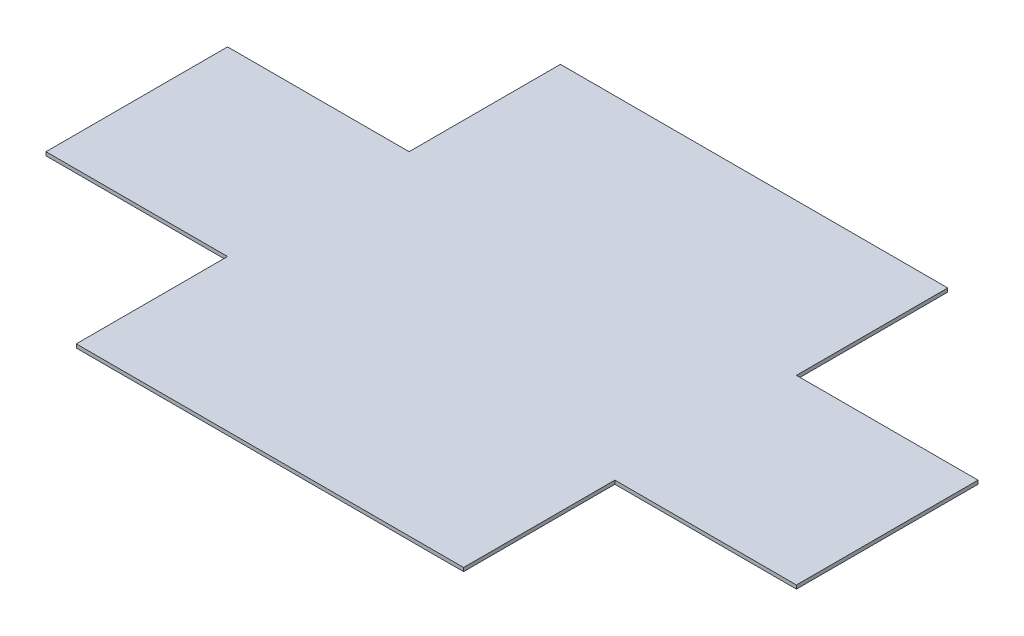
ISO-10303-21;
HEADER;
FILE_DESCRIPTION(('STEP AP214'),'2;1');
FILE_NAME('part.step','',(''),(''),'','','');
FILE_SCHEMA(('AUTOMOTIVE_DESIGN { 1 0 10303 214 1 1 1 1 }'));
ENDSEC;
DATA;
#1=APPLICATION_CONTEXT('core data for automotive mechanical design processes');
#2=APPLICATION_PROTOCOL_DEFINITION('international standard','automotive_design',2000,#1);
#3=PRODUCT_CONTEXT('',#1,'mechanical');
#4=PRODUCT('Part','Part','',(#3));
#5=PRODUCT_RELATED_PRODUCT_CATEGORY('part','',(#4));
#6=PRODUCT_DEFINITION_FORMATION('','',#4);
#7=PRODUCT_DEFINITION_CONTEXT('part definition',#1,'design');
#8=PRODUCT_DEFINITION('design','',#6,#7);
#9=PRODUCT_DEFINITION_SHAPE('','',#8);
#10=(LENGTH_UNIT() NAMED_UNIT(*) SI_UNIT(.MILLI.,.METRE.));
#11=(NAMED_UNIT(*) PLANE_ANGLE_UNIT() SI_UNIT($,.RADIAN.));
#12=(NAMED_UNIT(*) SI_UNIT($,.STERADIAN.) SOLID_ANGLE_UNIT());
#13=UNCERTAINTY_MEASURE_WITH_UNIT(LENGTH_MEASURE(1.E-05),#10,'distance_accuracy_value','');
#14=(GEOMETRIC_REPRESENTATION_CONTEXT(3) GLOBAL_UNCERTAINTY_ASSIGNED_CONTEXT((#13)) GLOBAL_UNIT_ASSIGNED_CONTEXT((#10,
#11,#12)) REPRESENTATION_CONTEXT('',''));
#15=CARTESIAN_POINT('',(0.,0.,0.));
#16=DIRECTION('',(0.,0.,1.));
#17=DIRECTION('',(1.,0.,0.));
#18=AXIS2_PLACEMENT_3D('',#15,#16,#17);
#19=CARTESIAN_POINT('',(160.,3.,-75.));
#20=DIRECTION('',(0.,0.,1.));
#21=DIRECTION('',(1.,0.,0.));
#22=AXIS2_PLACEMENT_3D('',#19,#20,#21);
#23=PLANE('',#22);
#24=DIRECTION('',(-1.,0.,0.));
#25=VECTOR('',#24,1.);
#26=CARTESIAN_POINT('',(160.,0.,-75.));
#27=LINE('',#26,#25);
#28=CARTESIAN_POINT('',(310.,0.,-75.));
#29=VERTEX_POINT('',#28);
#30=CARTESIAN_POINT('',(160.,0.,-75.));
#31=VERTEX_POINT('',#30);
#32=EDGE_CURVE('E155',#29,#31,#27,.T.);
#33=ORIENTED_EDGE('',*,*,#32,.T.);
#34=DIRECTION('',(0.,-1.,0.));
#35=VECTOR('',#34,1.);
#36=CARTESIAN_POINT('',(160.,3.,-75.));
#37=LINE('',#36,#35);
#38=CARTESIAN_POINT('',(160.,3.,-75.));
#39=VERTEX_POINT('',#38);
#40=EDGE_CURVE('E11',#39,#31,#37,.T.);
#41=ORIENTED_EDGE('',*,*,#40,.F.);
#42=DIRECTION('',(-1.,0.,0.));
#43=VECTOR('',#42,1.);
#44=CARTESIAN_POINT('',(160.,3.,-75.));
#45=LINE('',#44,#43);
#46=CARTESIAN_POINT('',(310.,3.,-75.));
#47=VERTEX_POINT('',#46);
#48=EDGE_CURVE('E177',#47,#39,#45,.T.);
#49=ORIENTED_EDGE('',*,*,#48,.F.);
#50=DIRECTION('',(0.,-1.,0.));
#51=VECTOR('',#50,1.);
#52=CARTESIAN_POINT('',(310.,3.,-75.));
#53=LINE('',#52,#51);
#54=EDGE_CURVE('E151',#47,#29,#53,.T.);
#55=ORIENTED_EDGE('',*,*,#54,.T.);
#56=EDGE_LOOP('',(#33,#41,#49,#55));
#57=FACE_BOUND('',#56,.T.);
#58=ADVANCED_FACE('F35',(#57),#23,.F.);
#59=CARTESIAN_POINT('',(160.,3.,-75.));
#60=DIRECTION('',(-1.,0.,0.));
#61=DIRECTION('',(0.,0.,1.));
#62=AXIS2_PLACEMENT_3D('',#59,#60,#61);
#63=PLANE('',#62);
#64=DIRECTION('',(0.,0.,-1.));
#65=VECTOR('',#64,1.);
#66=CARTESIAN_POINT('',(160.,0.,-75.));
#67=LINE('',#66,#65);
#68=CARTESIAN_POINT('',(160.,0.,-200.));
#69=VERTEX_POINT('',#68);
#70=EDGE_CURVE('E158',#31,#69,#67,.T.);
#71=ORIENTED_EDGE('',*,*,#70,.T.);
#72=DIRECTION('',(0.,-1.,0.));
#73=VECTOR('',#72,1.);
#74=CARTESIAN_POINT('',(160.,3.,-200.));
#75=LINE('',#74,#73);
#76=CARTESIAN_POINT('',(160.,3.,-200.));
#77=VERTEX_POINT('',#76);
#78=EDGE_CURVE('E43',#77,#69,#75,.T.);
#79=ORIENTED_EDGE('',*,*,#78,.F.);
#80=DIRECTION('',(0.,0.,-1.));
#81=VECTOR('',#80,1.);
#82=CARTESIAN_POINT('',(160.,3.,-75.));
#83=LINE('',#82,#81);
#84=EDGE_CURVE('E106',#39,#77,#83,.T.);
#85=ORIENTED_EDGE('',*,*,#84,.F.);
#86=ORIENTED_EDGE('',*,*,#40,.T.);
#87=EDGE_LOOP('',(#71,#79,#85,#86));
#88=FACE_BOUND('',#87,.T.);
#89=ADVANCED_FACE('F255',(#88),#63,.F.);
#90=CARTESIAN_POINT('',(-160.,3.,-200.));
#91=DIRECTION('',(0.,0.,1.));
#92=DIRECTION('',(1.,0.,0.));
#93=AXIS2_PLACEMENT_3D('',#90,#91,#92);
#94=PLANE('',#93);
#95=DIRECTION('',(-1.,0.,0.));
#96=VECTOR('',#95,1.);
#97=CARTESIAN_POINT('',(-160.,0.,-200.));
#98=LINE('',#97,#96);
#99=CARTESIAN_POINT('',(-160.,0.,-200.));
#100=VERTEX_POINT('',#99);
#101=EDGE_CURVE('E160',#69,#100,#98,.T.);
#102=ORIENTED_EDGE('',*,*,#101,.T.);
#103=DIRECTION('',(0.,-1.,0.));
#104=VECTOR('',#103,1.);
#105=CARTESIAN_POINT('',(-160.,3.,-200.));
#106=LINE('',#105,#104);
#107=CARTESIAN_POINT('',(-160.,3.,-200.));
#108=VERTEX_POINT('',#107);
#109=EDGE_CURVE('E196',#108,#100,#106,.T.);
#110=ORIENTED_EDGE('',*,*,#109,.F.);
#111=DIRECTION('',(-1.,0.,0.));
#112=VECTOR('',#111,1.);
#113=CARTESIAN_POINT('',(-160.,3.,-200.));
#114=LINE('',#113,#112);
#115=EDGE_CURVE('E204',#77,#108,#114,.T.);
#116=ORIENTED_EDGE('',*,*,#115,.F.);
#117=ORIENTED_EDGE('',*,*,#78,.T.);
#118=EDGE_LOOP('',(#102,#110,#116,#117));
#119=FACE_BOUND('',#118,.T.);
#120=ADVANCED_FACE('F202',(#119),#94,.F.);
#121=CARTESIAN_POINT('',(-160.,3.,-75.));
#122=DIRECTION('',(1.,0.,0.));
#123=DIRECTION('',(0.,0.,-1.));
#124=AXIS2_PLACEMENT_3D('',#121,#122,#123);
#125=PLANE('',#124);
#126=DIRECTION('',(0.,0.,1.));
#127=VECTOR('',#126,1.);
#128=CARTESIAN_POINT('',(-160.,0.,-75.));
#129=LINE('',#128,#127);
#130=CARTESIAN_POINT('',(-160.,0.,-75.));
#131=VERTEX_POINT('',#130);
#132=EDGE_CURVE('E162',#100,#131,#129,.T.);
#133=ORIENTED_EDGE('',*,*,#132,.T.);
#134=DIRECTION('',(0.,-1.,0.));
#135=VECTOR('',#134,1.);
#136=CARTESIAN_POINT('',(-160.,3.,-75.));
#137=LINE('',#136,#135);
#138=CARTESIAN_POINT('',(-160.,3.,-75.));
#139=VERTEX_POINT('',#138);
#140=EDGE_CURVE('E193',#139,#131,#137,.T.);
#141=ORIENTED_EDGE('',*,*,#140,.F.);
#142=DIRECTION('',(0.,0.,1.));
#143=VECTOR('',#142,1.);
#144=CARTESIAN_POINT('',(-160.,3.,-75.));
#145=LINE('',#144,#143);
#146=EDGE_CURVE('E222',#108,#139,#145,.T.);
#147=ORIENTED_EDGE('',*,*,#146,.F.);
#148=ORIENTED_EDGE('',*,*,#109,.T.);
#149=EDGE_LOOP('',(#133,#141,#147,#148));
#150=FACE_BOUND('',#149,.T.);
#151=ADVANCED_FACE('F213',(#150),#125,.F.);
#152=CARTESIAN_POINT('',(-310.,3.,-75.));
#153=DIRECTION('',(0.,0.,1.));
#154=DIRECTION('',(1.,0.,0.));
#155=AXIS2_PLACEMENT_3D('',#152,#153,#154);
#156=PLANE('',#155);
#157=DIRECTION('',(-1.,0.,0.));
#158=VECTOR('',#157,1.);
#159=CARTESIAN_POINT('',(-310.,0.,-75.));
#160=LINE('',#159,#158);
#161=CARTESIAN_POINT('',(-310.,0.,-75.));
#162=VERTEX_POINT('',#161);
#163=EDGE_CURVE('E164',#131,#162,#160,.T.);
#164=ORIENTED_EDGE('',*,*,#163,.T.);
#165=DIRECTION('',(0.,-1.,0.));
#166=VECTOR('',#165,1.);
#167=CARTESIAN_POINT('',(-310.,3.,-75.));
#168=LINE('',#167,#166);
#169=CARTESIAN_POINT('',(-310.,3.,-75.));
#170=VERTEX_POINT('',#169);
#171=EDGE_CURVE('E190',#170,#162,#168,.T.);
#172=ORIENTED_EDGE('',*,*,#171,.F.);
#173=DIRECTION('',(-1.,0.,0.));
#174=VECTOR('',#173,1.);
#175=CARTESIAN_POINT('',(-310.,3.,-75.));
#176=LINE('',#175,#174);
#177=EDGE_CURVE('E219',#139,#170,#176,.T.);
#178=ORIENTED_EDGE('',*,*,#177,.F.);
#179=ORIENTED_EDGE('',*,*,#140,.T.);
#180=EDGE_LOOP('',(#164,#172,#178,#179));
#181=FACE_BOUND('',#180,.T.);
#182=ADVANCED_FACE('F217',(#181),#156,.F.);
#183=CARTESIAN_POINT('',(-310.,3.,75.0000000000001));
#184=DIRECTION('',(1.,0.,0.));
#185=DIRECTION('',(0.,0.,-1.));
#186=AXIS2_PLACEMENT_3D('',#183,#184,#185);
#187=PLANE('',#186);
#188=DIRECTION('',(0.,0.,1.));
#189=VECTOR('',#188,1.);
#190=CARTESIAN_POINT('',(-310.,0.,75.0000000000001));
#191=LINE('',#190,#189);
#192=CARTESIAN_POINT('',(-310.,0.,75.0000000000001));
#193=VERTEX_POINT('',#192);
#194=EDGE_CURVE('E166',#162,#193,#191,.T.);
#195=ORIENTED_EDGE('',*,*,#194,.T.);
#196=DIRECTION('',(0.,-1.,0.));
#197=VECTOR('',#196,1.);
#198=CARTESIAN_POINT('',(-310.,3.,75.0000000000001));
#199=LINE('',#198,#197);
#200=CARTESIAN_POINT('',(-310.,3.,75.0000000000001));
#201=VERTEX_POINT('',#200);
#202=EDGE_CURVE('E187',#201,#193,#199,.T.);
#203=ORIENTED_EDGE('',*,*,#202,.F.);
#204=DIRECTION('',(0.,0.,1.));
#205=VECTOR('',#204,1.);
#206=CARTESIAN_POINT('',(-310.,3.,75.0000000000001));
#207=LINE('',#206,#205);
#208=EDGE_CURVE('E221',#170,#201,#207,.T.);
#209=ORIENTED_EDGE('',*,*,#208,.F.);
#210=ORIENTED_EDGE('',*,*,#171,.T.);
#211=EDGE_LOOP('',(#195,#203,#209,#210));
#212=FACE_BOUND('',#211,.T.);
#213=ADVANCED_FACE('F268',(#212),#187,.F.);
#214=CARTESIAN_POINT('',(-310.,3.,75.0000000000001));
#215=DIRECTION('',(0.,0.,-1.));
#216=DIRECTION('',(-1.,0.,0.));
#217=AXIS2_PLACEMENT_3D('',#214,#215,#216);
#218=PLANE('',#217);
#219=DIRECTION('',(1.,0.,0.));
#220=VECTOR('',#219,1.);
#221=CARTESIAN_POINT('',(-310.,0.,75.0000000000001));
#222=LINE('',#221,#220);
#223=CARTESIAN_POINT('',(-160.,0.,75.0000000000001));
#224=VERTEX_POINT('',#223);
#225=EDGE_CURVE('E168',#193,#224,#222,.T.);
#226=ORIENTED_EDGE('',*,*,#225,.T.);
#227=DIRECTION('',(0.,-1.,0.));
#228=VECTOR('',#227,1.);
#229=CARTESIAN_POINT('',(-160.,3.,75.0000000000001));
#230=LINE('',#229,#228);
#231=CARTESIAN_POINT('',(-160.,3.,75.0000000000001));
#232=VERTEX_POINT('',#231);
#233=EDGE_CURVE('E184',#232,#224,#230,.T.);
#234=ORIENTED_EDGE('',*,*,#233,.F.);
#235=DIRECTION('',(1.,0.,0.));
#236=VECTOR('',#235,1.);
#237=CARTESIAN_POINT('',(-310.,3.,75.0000000000001));
#238=LINE('',#237,#236);
#239=EDGE_CURVE('E224',#201,#232,#238,.T.);
#240=ORIENTED_EDGE('',*,*,#239,.F.);
#241=ORIENTED_EDGE('',*,*,#202,.T.);
#242=EDGE_LOOP('',(#226,#234,#240,#241));
#243=FACE_BOUND('',#242,.T.);
#244=ADVANCED_FACE('F271',(#243),#218,.F.);
#245=CARTESIAN_POINT('',(-160.,3.,200.));
#246=DIRECTION('',(1.,0.,0.));
#247=DIRECTION('',(0.,0.,-1.));
#248=AXIS2_PLACEMENT_3D('',#245,#246,#247);
#249=PLANE('',#248);
#250=DIRECTION('',(0.,0.,1.));
#251=VECTOR('',#250,1.);
#252=CARTESIAN_POINT('',(-160.,0.,200.));
#253=LINE('',#252,#251);
#254=CARTESIAN_POINT('',(-160.,0.,200.));
#255=VERTEX_POINT('',#254);
#256=EDGE_CURVE('E170',#224,#255,#253,.T.);
#257=ORIENTED_EDGE('',*,*,#256,.T.);
#258=DIRECTION('',(0.,-1.,0.));
#259=VECTOR('',#258,1.);
#260=CARTESIAN_POINT('',(-160.,3.,200.));
#261=LINE('',#260,#259);
#262=CARTESIAN_POINT('',(-160.,3.,200.));
#263=VERTEX_POINT('',#262);
#264=EDGE_CURVE('E181',#263,#255,#261,.T.);
#265=ORIENTED_EDGE('',*,*,#264,.F.);
#266=DIRECTION('',(0.,0.,1.));
#267=VECTOR('',#266,1.);
#268=CARTESIAN_POINT('',(-160.,3.,200.));
#269=LINE('',#268,#267);
#270=EDGE_CURVE('E230',#232,#263,#269,.T.);
#271=ORIENTED_EDGE('',*,*,#270,.F.);
#272=ORIENTED_EDGE('',*,*,#233,.T.);
#273=EDGE_LOOP('',(#257,#265,#271,#272));
#274=FACE_BOUND('',#273,.T.);
#275=ADVANCED_FACE('F236',(#274),#249,.F.);
#276=CARTESIAN_POINT('',(-160.,3.,200.));
#277=DIRECTION('',(0.,0.,-1.));
#278=DIRECTION('',(-1.,0.,0.));
#279=AXIS2_PLACEMENT_3D('',#276,#277,#278);
#280=PLANE('',#279);
#281=DIRECTION('',(1.,0.,0.));
#282=VECTOR('',#281,1.);
#283=CARTESIAN_POINT('',(-160.,0.,200.));
#284=LINE('',#283,#282);
#285=CARTESIAN_POINT('',(160.,0.,200.));
#286=VERTEX_POINT('',#285);
#287=EDGE_CURVE('E172',#255,#286,#284,.T.);
#288=ORIENTED_EDGE('',*,*,#287,.T.);
#289=DIRECTION('',(0.,-1.,0.));
#290=VECTOR('',#289,1.);
#291=CARTESIAN_POINT('',(160.,3.,200.));
#292=LINE('',#291,#290);
#293=CARTESIAN_POINT('',(160.,3.,200.));
#294=VERTEX_POINT('',#293);
#295=EDGE_CURVE('E146',#294,#286,#292,.T.);
#296=ORIENTED_EDGE('',*,*,#295,.F.);
#297=DIRECTION('',(1.,0.,0.));
#298=VECTOR('',#297,1.);
#299=CARTESIAN_POINT('',(-160.,3.,200.));
#300=LINE('',#299,#298);
#301=EDGE_CURVE('E137',#263,#294,#300,.T.);
#302=ORIENTED_EDGE('',*,*,#301,.F.);
#303=ORIENTED_EDGE('',*,*,#264,.T.);
#304=EDGE_LOOP('',(#288,#296,#302,#303));
#305=FACE_BOUND('',#304,.T.);
#306=ADVANCED_FACE('F240',(#305),#280,.F.);
#307=CARTESIAN_POINT('',(160.,3.,200.));
#308=DIRECTION('',(-1.,0.,0.));
#309=DIRECTION('',(0.,0.,1.));
#310=AXIS2_PLACEMENT_3D('',#307,#308,#309);
#311=PLANE('',#310);
#312=DIRECTION('',(0.,0.,-1.));
#313=VECTOR('',#312,1.);
#314=CARTESIAN_POINT('',(160.,0.,200.));
#315=LINE('',#314,#313);
#316=CARTESIAN_POINT('',(160.,0.,75.0000000000001));
#317=VERTEX_POINT('',#316);
#318=EDGE_CURVE('E145',#286,#317,#315,.T.);
#319=ORIENTED_EDGE('',*,*,#318,.T.);
#320=DIRECTION('',(0.,-1.,0.));
#321=VECTOR('',#320,1.);
#322=CARTESIAN_POINT('',(160.,3.,75.0000000000001));
#323=LINE('',#322,#321);
#324=CARTESIAN_POINT('',(160.,3.,75.0000000000001));
#325=VERTEX_POINT('',#324);
#326=EDGE_CURVE('E142',#325,#317,#323,.T.);
#327=ORIENTED_EDGE('',*,*,#326,.F.);
#328=DIRECTION('',(0.,0.,-1.));
#329=VECTOR('',#328,1.);
#330=CARTESIAN_POINT('',(160.,3.,200.));
#331=LINE('',#330,#329);
#332=EDGE_CURVE('E131',#294,#325,#331,.T.);
#333=ORIENTED_EDGE('',*,*,#332,.F.);
#334=ORIENTED_EDGE('',*,*,#295,.T.);
#335=EDGE_LOOP('',(#319,#327,#333,#334));
#336=FACE_BOUND('',#335,.T.);
#337=ADVANCED_FACE('F143',(#336),#311,.F.);
#338=CARTESIAN_POINT('',(160.,3.,75.0000000000001));
#339=DIRECTION('',(0.,0.,-1.));
#340=DIRECTION('',(-1.,0.,0.));
#341=AXIS2_PLACEMENT_3D('',#338,#339,#340);
#342=PLANE('',#341);
#343=DIRECTION('',(1.,0.,0.));
#344=VECTOR('',#343,1.);
#345=CARTESIAN_POINT('',(160.,0.,75.0000000000001));
#346=LINE('',#345,#344);
#347=CARTESIAN_POINT('',(310.,0.,75.0000000000001));
#348=VERTEX_POINT('',#347);
#349=EDGE_CURVE('E92',#317,#348,#346,.T.);
#350=ORIENTED_EDGE('',*,*,#349,.T.);
#351=DIRECTION('',(0.,-1.,0.));
#352=VECTOR('',#351,1.);
#353=CARTESIAN_POINT('',(310.,3.,75.0000000000001));
#354=LINE('',#353,#352);
#355=CARTESIAN_POINT('',(310.,3.,75.0000000000001));
#356=VERTEX_POINT('',#355);
#357=EDGE_CURVE('E147',#356,#348,#354,.T.);
#358=ORIENTED_EDGE('',*,*,#357,.F.);
#359=DIRECTION('',(1.,0.,0.));
#360=VECTOR('',#359,1.);
#361=CARTESIAN_POINT('',(160.,3.,75.0000000000001));
#362=LINE('',#361,#360);
#363=EDGE_CURVE('E135',#325,#356,#362,.T.);
#364=ORIENTED_EDGE('',*,*,#363,.F.);
#365=ORIENTED_EDGE('',*,*,#326,.T.);
#366=EDGE_LOOP('',(#350,#358,#364,#365));
#367=FACE_BOUND('',#366,.T.);
#368=ADVANCED_FACE('F149',(#367),#342,.F.);
#369=CARTESIAN_POINT('',(310.,3.,75.0000000000001));
#370=DIRECTION('',(-1.,0.,0.));
#371=DIRECTION('',(0.,0.,1.));
#372=AXIS2_PLACEMENT_3D('',#369,#370,#371);
#373=PLANE('',#372);
#374=DIRECTION('',(0.,0.,-1.));
#375=VECTOR('',#374,1.);
#376=CARTESIAN_POINT('',(310.,0.,75.0000000000001));
#377=LINE('',#376,#375);
#378=EDGE_CURVE('E98',#348,#29,#377,.T.);
#379=ORIENTED_EDGE('',*,*,#378,.T.);
#380=ORIENTED_EDGE('',*,*,#54,.F.);
#381=DIRECTION('',(0.,0.,-1.));
#382=VECTOR('',#381,1.);
#383=CARTESIAN_POINT('',(310.,3.,75.0000000000001));
#384=LINE('',#383,#382);
#385=EDGE_CURVE('E51',#356,#47,#384,.T.);
#386=ORIENTED_EDGE('',*,*,#385,.F.);
#387=ORIENTED_EDGE('',*,*,#357,.T.);
#388=EDGE_LOOP('',(#379,#380,#386,#387));
#389=FACE_BOUND('',#388,.T.);
#390=ADVANCED_FACE('F244',(#389),#373,.F.);
#391=CARTESIAN_POINT('',(0.,3.,0.));
#392=DIRECTION('',(0.,1.,0.));
#393=DIRECTION('',(0.,0.,1.));
#394=AXIS2_PLACEMENT_3D('',#391,#392,#393);
#395=PLANE('',#394);
#396=ORIENTED_EDGE('',*,*,#48,.T.);
#397=ORIENTED_EDGE('',*,*,#84,.T.);
#398=ORIENTED_EDGE('',*,*,#115,.T.);
#399=ORIENTED_EDGE('',*,*,#146,.T.);
#400=ORIENTED_EDGE('',*,*,#177,.T.);
#401=ORIENTED_EDGE('',*,*,#208,.T.);
#402=ORIENTED_EDGE('',*,*,#239,.T.);
#403=ORIENTED_EDGE('',*,*,#270,.T.);
#404=ORIENTED_EDGE('',*,*,#301,.T.);
#405=ORIENTED_EDGE('',*,*,#332,.T.);
#406=ORIENTED_EDGE('',*,*,#363,.T.);
#407=ORIENTED_EDGE('',*,*,#385,.T.);
#408=EDGE_LOOP('',(#396,#397,#398,#399,#400,#401,#402,#403,#404,#405,#406,#407));
#409=FACE_BOUND('',#408,.T.);
#410=ADVANCED_FACE('F133',(#409),#395,.T.);
#411=CARTESIAN_POINT('',(0.,0.,0.));
#412=DIRECTION('',(0.,1.,0.));
#413=DIRECTION('',(0.,0.,1.));
#414=AXIS2_PLACEMENT_3D('',#411,#412,#413);
#415=PLANE('',#414);
#416=ORIENTED_EDGE('',*,*,#32,.F.);
#417=ORIENTED_EDGE('',*,*,#378,.F.);
#418=ORIENTED_EDGE('',*,*,#349,.F.);
#419=ORIENTED_EDGE('',*,*,#318,.F.);
#420=ORIENTED_EDGE('',*,*,#287,.F.);
#421=ORIENTED_EDGE('',*,*,#256,.F.);
#422=ORIENTED_EDGE('',*,*,#225,.F.);
#423=ORIENTED_EDGE('',*,*,#194,.F.);
#424=ORIENTED_EDGE('',*,*,#163,.F.);
#425=ORIENTED_EDGE('',*,*,#132,.F.);
#426=ORIENTED_EDGE('',*,*,#101,.F.);
#427=ORIENTED_EDGE('',*,*,#70,.F.);
#428=EDGE_LOOP('',(#416,#417,#418,#419,#420,#421,#422,#423,#424,#425,#426,#427));
#429=FACE_BOUND('',#428,.T.);
#430=ADVANCED_FACE('F208',(#429),#415,.F.);
#431=CLOSED_SHELL('',(#58,#89,#120,#151,#182,#213,#244,#275,#306,#337,#368,#390,#410,#430));
#432=MANIFOLD_SOLID_BREP('B2',#431);
#433=ADVANCED_BREP_SHAPE_REPRESENTATION('',(#18,#432),#14);
#434=SHAPE_DEFINITION_REPRESENTATION(#9,#433);
ENDSEC;
END-ISO-10303-21;
